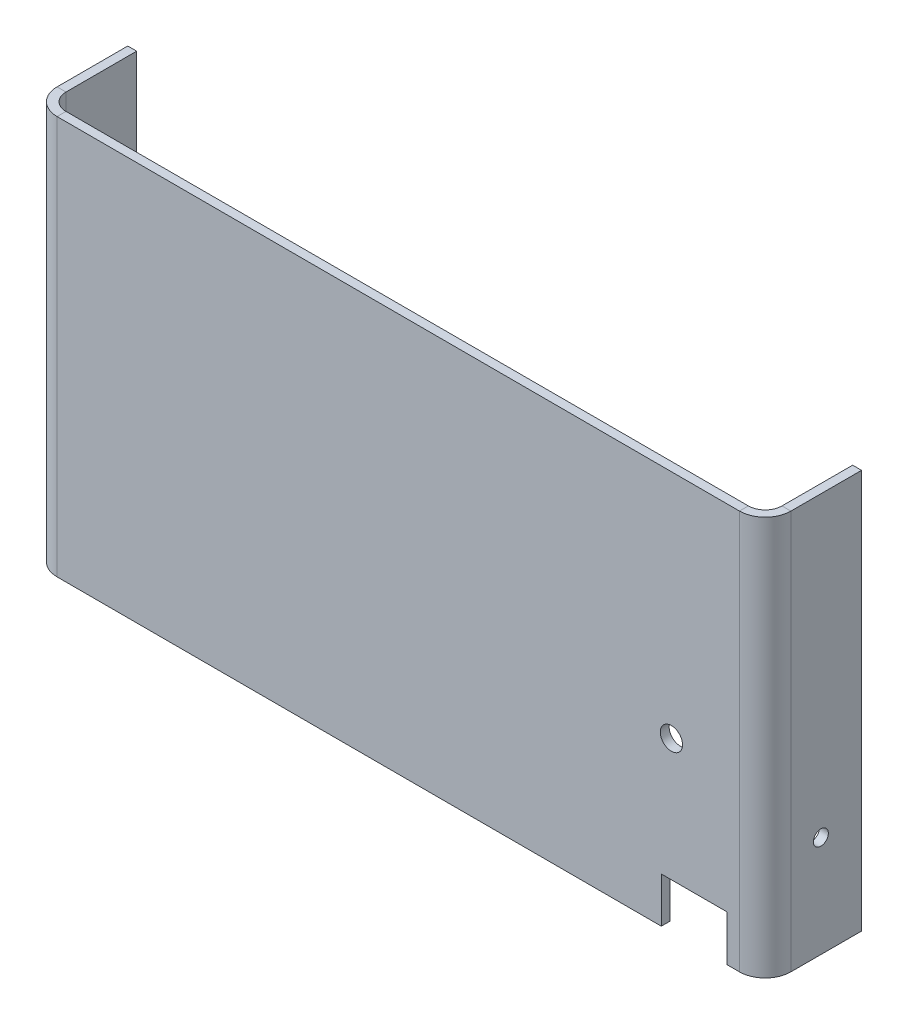
ISO-10303-21;
HEADER;
FILE_DESCRIPTION(('STEP AP214'),'2;1');
FILE_NAME('part.step','',(''),(''),'','','');
FILE_SCHEMA(('AUTOMOTIVE_DESIGN { 1 0 10303 214 1 1 1 1 }'));
ENDSEC;
DATA;
#1=APPLICATION_CONTEXT('core data for automotive mechanical design processes');
#2=APPLICATION_PROTOCOL_DEFINITION('international standard','automotive_design',2000,#1);
#3=PRODUCT_CONTEXT('',#1,'mechanical');
#4=PRODUCT('Part','Part','',(#3));
#5=PRODUCT_RELATED_PRODUCT_CATEGORY('part','',(#4));
#6=PRODUCT_DEFINITION_FORMATION('','',#4);
#7=PRODUCT_DEFINITION_CONTEXT('part definition',#1,'design');
#8=PRODUCT_DEFINITION('design','',#6,#7);
#9=PRODUCT_DEFINITION_SHAPE('','',#8);
#10=(LENGTH_UNIT() NAMED_UNIT(*) SI_UNIT(.MILLI.,.METRE.));
#11=(NAMED_UNIT(*) PLANE_ANGLE_UNIT() SI_UNIT($,.RADIAN.));
#12=(NAMED_UNIT(*) SI_UNIT($,.STERADIAN.) SOLID_ANGLE_UNIT());
#13=UNCERTAINTY_MEASURE_WITH_UNIT(LENGTH_MEASURE(1.E-05),#10,'distance_accuracy_value','');
#14=(GEOMETRIC_REPRESENTATION_CONTEXT(3) GLOBAL_UNCERTAINTY_ASSIGNED_CONTEXT((#13)) GLOBAL_UNIT_ASSIGNED_CONTEXT((#10,
#11,#12)) REPRESENTATION_CONTEXT('',''));
#15=CARTESIAN_POINT('',(0.,0.,0.));
#16=DIRECTION('',(0.,0.,1.));
#17=DIRECTION('',(1.,0.,0.));
#18=AXIS2_PLACEMENT_3D('',#15,#16,#17);
#19=CARTESIAN_POINT('',(-17.6037651662506,-31.8234781341149,2.54));
#20=DIRECTION('',(0.,-1.,0.));
#21=DIRECTION('',(1.,0.,0.));
#22=AXIS2_PLACEMENT_3D('',#19,#20,#21);
#23=PLANE('',#22);
#24=DIRECTION('',(1.,0.,0.));
#25=VECTOR('',#24,1.);
#26=CARTESIAN_POINT('',(-134.62,-31.8234781341149,1.1938));
#27=LINE('',#26,#25);
#28=CARTESIAN_POINT('',(-17.6037651662506,-31.8234781341149,1.1938));
#29=VERTEX_POINT('',#28);
#30=CARTESIAN_POINT('',(-15.7315905808416,-31.8234781341149,1.1938));
#31=VERTEX_POINT('',#30);
#32=EDGE_CURVE('E450',#29,#31,#27,.T.);
#33=ORIENTED_EDGE('',*,*,#32,.T.);
#34=DIRECTION('',(0.,0.,1.));
#35=VECTOR('',#34,1.);
#36=CARTESIAN_POINT('',(-15.7315905808416,-31.8234781341149,2.54));
#37=LINE('',#36,#35);
#38=CARTESIAN_POINT('',(-15.7315905808416,-31.8234781341149,2.54));
#39=VERTEX_POINT('',#38);
#40=EDGE_CURVE('E534',#31,#39,#37,.T.);
#41=ORIENTED_EDGE('',*,*,#40,.T.);
#42=DIRECTION('',(1.,0.,0.));
#43=VECTOR('',#42,1.);
#44=CARTESIAN_POINT('',(-17.6037651662506,-31.8234781341149,2.54));
#45=LINE('',#44,#43);
#46=CARTESIAN_POINT('',(-17.6037651662506,-31.8234781341149,2.54));
#47=VERTEX_POINT('',#46);
#48=EDGE_CURVE('E441',#47,#39,#45,.T.);
#49=ORIENTED_EDGE('',*,*,#48,.F.);
#50=DIRECTION('',(0.,0.,1.));
#51=VECTOR('',#50,1.);
#52=CARTESIAN_POINT('',(-17.6037651662506,-31.8234781341149,2.54));
#53=LINE('',#52,#51);
#54=EDGE_CURVE('E445',#29,#47,#53,.T.);
#55=ORIENTED_EDGE('',*,*,#54,.F.);
#56=EDGE_LOOP('',(#33,#41,#49,#55));
#57=FACE_BOUND('',#56,.T.);
#58=ADVANCED_FACE('F63',(#57),#23,.T.);
#59=CARTESIAN_POINT('',(-2.77420292184407E-05,28.5015218658787,2.54));
#60=DIRECTION('',(0.000641991522611136,0.999999793923421,0.));
#61=DIRECTION('',(-0.999999793923421,0.000641991522611136,0.));
#62=AXIS2_PLACEMENT_3D('',#59,#60,#61);
#63=PLANE('',#62);
#64=DIRECTION('',(-0.999999793923421,0.000641991522611136,0.));
#65=VECTOR('',#64,1.);
#66=CARTESIAN_POINT('',(-2.77420292184407E-05,28.5015218658787,2.54));
#67=LINE('',#66,#65);
#68=CARTESIAN_POINT('',(-15.7315905808416,28.5116213979399,2.54));
#69=VERTEX_POINT('',#68);
#70=CARTESIAN_POINT('',(-118.888437161188,28.5778472325914,2.54));
#71=VERTEX_POINT('',#70);
#72=EDGE_CURVE('E446',#69,#71,#67,.T.);
#73=ORIENTED_EDGE('',*,*,#72,.F.);
#74=CARTESIAN_POINT('',(-15.7315905808416,28.5116213979399,1.1938));
#75=CARTESIAN_POINT('',(-15.7315905808416,28.5116213979399,2.54));
#76=B_SPLINE_CURVE_WITH_KNOTS('',1,(#74,#75),.UNSPECIFIED.,.F.,.F.,(2,2),(0.,1.),.UNSPECIFIED.);
#77=CARTESIAN_POINT('',(-15.7315905808416,28.5116213979399,1.1938));
#78=VERTEX_POINT('',#77);
#79=EDGE_CURVE('E12',#69,#78,#76,.F.);
#80=ORIENTED_EDGE('',*,*,#79,.T.);
#81=DIRECTION('',(-0.999999793923421,0.000641991522611136,0.));
#82=VECTOR('',#81,1.);
#83=CARTESIAN_POINT('',(-2.77420292184407E-05,28.5015218658787,1.1938));
#84=LINE('',#83,#82);
#85=CARTESIAN_POINT('',(-118.888437161188,28.5778472325914,1.1938));
#86=VERTEX_POINT('',#85);
#87=EDGE_CURVE('E460',#78,#86,#84,.T.);
#88=ORIENTED_EDGE('',*,*,#87,.T.);
#89=CARTESIAN_POINT('',(-118.888437161188,28.5778472325914,2.54));
#90=CARTESIAN_POINT('',(-118.888437161188,28.5778472325914,1.1938));
#91=B_SPLINE_CURVE_WITH_KNOTS('',1,(#89,#90),.UNSPECIFIED.,.F.,.F.,(2,2),(0.,1.),.UNSPECIFIED.);
#92=EDGE_CURVE('E422',#71,#86,#91,.T.);
#93=ORIENTED_EDGE('',*,*,#92,.F.);
#94=EDGE_LOOP('',(#73,#80,#88,#93));
#95=FACE_BOUND('',#94,.T.);
#96=ADVANCED_FACE('F65',(#95),#63,.T.);
#97=CARTESIAN_POINT('',(-134.62,-24.9109239929339,2.54));
#98=DIRECTION('',(0.,0.,1.));
#99=DIRECTION('',(1.,0.,0.));
#100=AXIS2_PLACEMENT_3D('',#97,#98,#99);
#101=PLANE('',#100);
#102=CARTESIAN_POINT('',(-26.0210000000003,-6.40070001477098,2.54));
#103=DIRECTION('',(0.,0.,1.));
#104=DIRECTION('',(1.,0.,0.));
#105=AXIS2_PLACEMENT_3D('',#102,#103,#104);
#106=CIRCLE('',#105,1.68394793953573);
#107=CARTESIAN_POINT('',(-24.3370520604646,-6.40070001477098,2.54));
#108=VERTEX_POINT('',#107);
#109=EDGE_CURVE('E442',#108,#108,#106,.T.);
#110=ORIENTED_EDGE('',*,*,#109,.F.);
#111=EDGE_LOOP('',(#110));
#112=FACE_BOUND('',#111,.T.);
#113=ORIENTED_EDGE('',*,*,#48,.T.);
#114=DIRECTION('',(0.,1.,0.));
#115=VECTOR('',#114,1.);
#116=CARTESIAN_POINT('',(-15.7315905808416,-24.9109239929339,2.54));
#117=LINE('',#116,#115);
#118=EDGE_CURVE('E529',#39,#69,#117,.T.);
#119=ORIENTED_EDGE('',*,*,#118,.T.);
#120=ORIENTED_EDGE('',*,*,#72,.T.);
#121=DIRECTION('',(0.,1.,0.));
#122=VECTOR('',#121,1.);
#123=CARTESIAN_POINT('',(-118.888437161188,-24.9109239929339,2.54));
#124=LINE('',#123,#122);
#125=CARTESIAN_POINT('',(-118.888437161188,-31.6913606575086,2.54));
#126=VERTEX_POINT('',#125);
#127=EDGE_CURVE('E469',#126,#71,#124,.T.);
#128=ORIENTED_EDGE('',*,*,#127,.F.);
#129=DIRECTION('',(0.999999793923421,-0.000641991522610961,0.));
#130=VECTOR('',#129,1.);
#131=CARTESIAN_POINT('',(-134.62,-31.6812611254473,2.54));
#132=LINE('',#131,#130);
#133=CARTESIAN_POINT('',(-27.5487101679567,-31.75,2.54));
#134=VERTEX_POINT('',#133);
#135=EDGE_CURVE('E435',#126,#134,#132,.T.);
#136=ORIENTED_EDGE('',*,*,#135,.T.);
#137=DIRECTION('',(0.,1.,0.));
#138=VECTOR('',#137,1.);
#139=CARTESIAN_POINT('',(-27.5487101679567,-31.75,2.54));
#140=LINE('',#139,#138);
#141=CARTESIAN_POINT('',(-27.5487101679567,-24.9109239929339,2.54));
#142=VERTEX_POINT('',#141);
#143=EDGE_CURVE('E426',#134,#142,#140,.T.);
#144=ORIENTED_EDGE('',*,*,#143,.T.);
#145=DIRECTION('',(1.,0.,0.));
#146=VECTOR('',#145,1.);
#147=CARTESIAN_POINT('',(-27.5487101679567,-24.9109239929339,2.54));
#148=LINE('',#147,#146);
#149=CARTESIAN_POINT('',(-17.6037651662506,-24.9109239929339,2.54));
#150=VERTEX_POINT('',#149);
#151=EDGE_CURVE('E434',#142,#150,#148,.T.);
#152=ORIENTED_EDGE('',*,*,#151,.T.);
#153=DIRECTION('',(0.,-1.,0.));
#154=VECTOR('',#153,1.);
#155=CARTESIAN_POINT('',(-17.6037651662506,-24.9109239929339,2.54));
#156=LINE('',#155,#154);
#157=EDGE_CURVE('E438',#150,#47,#156,.T.);
#158=ORIENTED_EDGE('',*,*,#157,.T.);
#159=EDGE_LOOP('',(#113,#119,#120,#128,#136,#144,#152,#158));
#160=FACE_BOUND('',#159,.T.);
#161=ADVANCED_FACE('F498',(#112,#160),#101,.T.);
#162=CARTESIAN_POINT('',(-134.62,-24.9109239929339,1.1938));
#163=DIRECTION('',(0.,0.,1.));
#164=DIRECTION('',(1.,0.,0.));
#165=AXIS2_PLACEMENT_3D('',#162,#163,#164);
#166=PLANE('',#165);
#167=DIRECTION('',(0.,1.,0.));
#168=VECTOR('',#167,1.);
#169=CARTESIAN_POINT('',(-15.7315905808416,-24.9109239929339,1.1938));
#170=LINE('',#169,#168);
#171=EDGE_CURVE('E75',#31,#78,#170,.T.);
#172=ORIENTED_EDGE('',*,*,#171,.F.);
#173=ORIENTED_EDGE('',*,*,#32,.F.);
#174=DIRECTION('',(0.,1.,0.));
#175=VECTOR('',#174,1.);
#176=CARTESIAN_POINT('',(-17.6037651662506,-24.9109239929339,1.1938));
#177=LINE('',#176,#175);
#178=CARTESIAN_POINT('',(-17.6037651662506,-24.9109239929339,1.1938));
#179=VERTEX_POINT('',#178);
#180=EDGE_CURVE('E447',#179,#29,#177,.F.);
#181=ORIENTED_EDGE('',*,*,#180,.F.);
#182=DIRECTION('',(1.,0.,0.));
#183=VECTOR('',#182,1.);
#184=CARTESIAN_POINT('',(-134.62,-24.9109239929339,1.1938));
#185=LINE('',#184,#183);
#186=CARTESIAN_POINT('',(-27.5487101679567,-24.9109239929339,1.1938));
#187=VERTEX_POINT('',#186);
#188=EDGE_CURVE('E451',#187,#179,#185,.T.);
#189=ORIENTED_EDGE('',*,*,#188,.F.);
#190=DIRECTION('',(0.,1.,0.));
#191=VECTOR('',#190,1.);
#192=CARTESIAN_POINT('',(-27.5487101679567,-24.9109239929339,1.1938));
#193=LINE('',#192,#191);
#194=CARTESIAN_POINT('',(-27.5487101679567,-31.75,1.1938));
#195=VERTEX_POINT('',#194);
#196=EDGE_CURVE('E454',#195,#187,#193,.T.);
#197=ORIENTED_EDGE('',*,*,#196,.F.);
#198=DIRECTION('',(0.999999793923421,-0.000641991522610961,0.));
#199=VECTOR('',#198,1.);
#200=CARTESIAN_POINT('',(-134.62,-31.6812611254473,1.1938));
#201=LINE('',#200,#199);
#202=CARTESIAN_POINT('',(-118.888437161188,-31.6913606575086,1.1938));
#203=VERTEX_POINT('',#202);
#204=EDGE_CURVE('E91',#203,#195,#201,.T.);
#205=ORIENTED_EDGE('',*,*,#204,.F.);
#206=DIRECTION('',(0.,1.,0.));
#207=VECTOR('',#206,1.);
#208=CARTESIAN_POINT('',(-118.888437161188,-24.9109239929339,1.1938));
#209=LINE('',#208,#207);
#210=EDGE_CURVE('E484',#203,#86,#209,.T.);
#211=ORIENTED_EDGE('',*,*,#210,.T.);
#212=ORIENTED_EDGE('',*,*,#87,.F.);
#213=EDGE_LOOP('',(#172,#173,#181,#189,#197,#205,#211,#212));
#214=FACE_BOUND('',#213,.T.);
#215=CARTESIAN_POINT('',(-26.0210000000003,-6.40070001477098,1.1938));
#216=DIRECTION('',(0.,0.,1.));
#217=DIRECTION('',(1.,0.,0.));
#218=AXIS2_PLACEMENT_3D('',#215,#216,#217);
#219=CIRCLE('',#218,1.68394793953573);
#220=CARTESIAN_POINT('',(-24.3370520604646,-6.40070001477098,1.1938));
#221=VERTEX_POINT('',#220);
#222=EDGE_CURVE('E457',#221,#221,#219,.T.);
#223=ORIENTED_EDGE('',*,*,#222,.T.);
#224=EDGE_LOOP('',(#223));
#225=FACE_BOUND('',#224,.T.);
#226=ADVANCED_FACE('F501',(#214,#225),#166,.F.);
#227=CARTESIAN_POINT('',(-27.5487101679567,-31.75,2.54));
#228=DIRECTION('',(1.,0.,0.));
#229=DIRECTION('',(0.,1.,0.));
#230=AXIS2_PLACEMENT_3D('',#227,#228,#229);
#231=PLANE('',#230);
#232=DIRECTION('',(0.,0.,1.));
#233=VECTOR('',#232,1.);
#234=CARTESIAN_POINT('',(-27.5487101679567,-31.75,2.54));
#235=LINE('',#234,#233);
#236=EDGE_CURVE('E466',#195,#134,#235,.T.);
#237=ORIENTED_EDGE('',*,*,#236,.F.);
#238=ORIENTED_EDGE('',*,*,#196,.T.);
#239=DIRECTION('',(0.,0.,1.));
#240=VECTOR('',#239,1.);
#241=CARTESIAN_POINT('',(-27.5487101679567,-24.9109239929339,2.54));
#242=LINE('',#241,#240);
#243=EDGE_CURVE('E464',#187,#142,#242,.T.);
#244=ORIENTED_EDGE('',*,*,#243,.T.);
#245=ORIENTED_EDGE('',*,*,#143,.F.);
#246=EDGE_LOOP('',(#237,#238,#244,#245));
#247=FACE_BOUND('',#246,.T.);
#248=ADVANCED_FACE('F506',(#247),#231,.T.);
#249=CARTESIAN_POINT('',(-27.5487101679567,-24.9109239929339,2.54));
#250=DIRECTION('',(0.,-1.,0.));
#251=DIRECTION('',(1.,0.,0.));
#252=AXIS2_PLACEMENT_3D('',#249,#250,#251);
#253=PLANE('',#252);
#254=ORIENTED_EDGE('',*,*,#243,.F.);
#255=ORIENTED_EDGE('',*,*,#188,.T.);
#256=DIRECTION('',(0.,0.,1.));
#257=VECTOR('',#256,1.);
#258=CARTESIAN_POINT('',(-17.6037651662506,-24.9109239929339,2.54));
#259=LINE('',#258,#257);
#260=EDGE_CURVE('E462',#179,#150,#259,.T.);
#261=ORIENTED_EDGE('',*,*,#260,.T.);
#262=ORIENTED_EDGE('',*,*,#151,.F.);
#263=EDGE_LOOP('',(#254,#255,#261,#262));
#264=FACE_BOUND('',#263,.T.);
#265=ADVANCED_FACE('F510',(#264),#253,.T.);
#266=CARTESIAN_POINT('',(-17.6037651662506,-24.9109239929339,2.54));
#267=DIRECTION('',(-1.,0.,0.));
#268=DIRECTION('',(0.,-1.,0.));
#269=AXIS2_PLACEMENT_3D('',#266,#267,#268);
#270=PLANE('',#269);
#271=ORIENTED_EDGE('',*,*,#260,.F.);
#272=ORIENTED_EDGE('',*,*,#180,.T.);
#273=ORIENTED_EDGE('',*,*,#54,.T.);
#274=ORIENTED_EDGE('',*,*,#157,.F.);
#275=EDGE_LOOP('',(#271,#272,#273,#274));
#276=FACE_BOUND('',#275,.T.);
#277=ADVANCED_FACE('F396',(#276),#270,.T.);
#278=CARTESIAN_POINT('',(-134.62,-31.6812611254473,2.54));
#279=DIRECTION('',(-0.000641991522610961,-0.999999793923421,0.));
#280=DIRECTION('',(0.999999793923421,-0.000641991522610961,0.));
#281=AXIS2_PLACEMENT_3D('',#278,#279,#280);
#282=PLANE('',#281);
#283=CARTESIAN_POINT('',(-118.888437161188,-31.6913606575086,1.1938));
#284=CARTESIAN_POINT('',(-118.888437161188,-31.6913606575086,2.54));
#285=B_SPLINE_CURVE_WITH_KNOTS('',1,(#283,#284),.UNSPECIFIED.,.F.,.F.,(2,2),(0.,1.),.UNSPECIFIED.);
#286=EDGE_CURVE('E479',#203,#126,#285,.T.);
#287=ORIENTED_EDGE('',*,*,#286,.F.);
#288=ORIENTED_EDGE('',*,*,#204,.T.);
#289=ORIENTED_EDGE('',*,*,#236,.T.);
#290=ORIENTED_EDGE('',*,*,#135,.F.);
#291=EDGE_LOOP('',(#287,#288,#289,#290));
#292=FACE_BOUND('',#291,.T.);
#293=ADVANCED_FACE('F486',(#292),#282,.T.);
#294=CARTESIAN_POINT('',(-26.0210000000003,-6.40070001477098,2.54));
#295=DIRECTION('',(0.,0.,1.));
#296=DIRECTION('',(1.,0.,0.));
#297=AXIS2_PLACEMENT_3D('',#294,#295,#296);
#298=CYLINDRICAL_SURFACE('',#297,1.68394793953573);
#299=ORIENTED_EDGE('',*,*,#109,.T.);
#300=EDGE_LOOP('',(#299));
#301=FACE_BOUND('',#300,.T.);
#302=ORIENTED_EDGE('',*,*,#222,.F.);
#303=EDGE_LOOP('',(#302));
#304=FACE_BOUND('',#303,.T.);
#305=ADVANCED_FACE('F496',(#301,#304),#298,.F.);
#306=CARTESIAN_POINT('',(-122.774637161188,-31.6881204449422,-1.34620000000001));
#307=CARTESIAN_POINT('',(-122.774637161188,-31.6883905113395,-0.837405891937508));
#308=CARTESIAN_POINT('',(-122.673489777256,-31.68866048037,-0.328995371802974));
#309=CARTESIAN_POINT('',(-122.28414582361,-31.6892005157977,0.610964081517382));
#310=CARTESIAN_POINT('',(-121.996102444116,-31.6894705335115,1.04205146316651));
#311=CARTESIAN_POINT('',(-121.276688624354,-31.6900105689393,1.7614652829278));
#312=CARTESIAN_POINT('',(-120.845601242705,-31.6902805866531,2.04950866242231));
#313=CARTESIAN_POINT('',(-119.905641789385,-31.6908206220808,2.43885261606841));
#314=CARTESIAN_POINT('',(-119.39723126925,-31.6910905911112,2.54));
#315=CARTESIAN_POINT('',(-118.888437161188,-31.6913606575086,2.54));
#316=CARTESIAN_POINT('',(-121.428437161188,-31.6881204449422,-1.34620000000001));
#317=CARTESIAN_POINT('',(-121.428437161188,-31.6883905113395,-1.01365483135435));
#318=CARTESIAN_POINT('',(-121.362327759925,-31.68866048037,-0.681360373727434));
#319=CARTESIAN_POINT('',(-121.107854587608,-31.6892005157977,-0.0670077898579207));
#320=CARTESIAN_POINT('',(-120.919590940879,-31.6894705335115,0.214748668736279));
#321=CARTESIAN_POINT('',(-120.449385829924,-31.6900105689393,0.684953779691374));
#322=CARTESIAN_POINT('',(-120.16762937133,-31.6902805866531,0.873217426419811));
#323=CARTESIAN_POINT('',(-119.55327678746,-31.6908206220808,1.12769059873752));
#324=CARTESIAN_POINT('',(-119.220982329833,-31.6910905911113,1.1938));
#325=CARTESIAN_POINT('',(-118.888437161188,-31.6913606575086,1.1938));
#326=B_SPLINE_SURFACE_WITH_KNOTS('',1,3,((#306,#307,#308,#309,#310,#311,#312,#313,#314,#315),
(#316,#317,#318,#319,#320,#321,#322,#323,#324,#325)),.UNSPECIFIED.,.F.,.F.,.F.,(2,2),(4,2,2,2,
4),(0.,1.),(0.,0.25,0.5,0.75,1.),.UNSPECIFIED.);
#327=CARTESIAN_POINT('',(-122.774637161188,-31.6881204449422,-1.34620000000001));
#328=CARTESIAN_POINT('',(-121.428437161188,-31.6881204449422,-1.34620000000001));
#329=B_SPLINE_CURVE_WITH_KNOTS('',1,(#327,#328),.UNSPECIFIED.,.F.,.F.,(2,2),(0.,1.),.UNSPECIFIED.);
#330=CARTESIAN_POINT('',(-121.428437161188,-31.6881204449422,-1.34620000000001));
#331=VERTEX_POINT('',#330);
#332=CARTESIAN_POINT('',(-122.774637161188,-31.6881204449422,-1.34620000000001));
#333=VERTEX_POINT('',#332);
#334=EDGE_CURVE('E608',#331,#333,#329,.F.);
#335=CARTESIAN_POINT('',(-121.428437161188,-31.6881204449422,-1.34620000000001));
#336=CARTESIAN_POINT('',(-121.428437161188,-31.6883905113395,-1.01365483135435));
#337=CARTESIAN_POINT('',(-121.362327759925,-31.68866048037,-0.681360373727434));
#338=CARTESIAN_POINT('',(-121.107854587608,-31.6892005157977,-0.0670077898579207));
#339=CARTESIAN_POINT('',(-120.919590940879,-31.6894705335115,0.214748668736279));
#340=CARTESIAN_POINT('',(-120.449385829924,-31.6900105689393,0.684953779691374));
#341=CARTESIAN_POINT('',(-120.16762937133,-31.6902805866531,0.873217426419811));
#342=CARTESIAN_POINT('',(-119.55327678746,-31.6908206220808,1.12769059873752));
#343=CARTESIAN_POINT('',(-119.220982329833,-31.6910905911113,1.1938));
#344=CARTESIAN_POINT('',(-118.888437161188,-31.6913606575086,1.1938));
#345=B_SPLINE_CURVE_WITH_KNOTS('',3,(#335,#336,#337,#338,#339,#340,#341,#342,#343,#344),
.UNSPECIFIED.,.F.,.F.,(4,2,2,2,4),(0.,0.25,0.5,0.75,1.),.UNSPECIFIED.);
#346=EDGE_CURVE('E610',#331,#203,#345,.T.);
#347=CARTESIAN_POINT('',(-118.888437161188,-31.6913606575086,2.54));
#348=CARTESIAN_POINT('',(-119.39723126925,-31.6910905911112,2.54));
#349=CARTESIAN_POINT('',(-119.905641789385,-31.6908206220808,2.43885261606841));
#350=CARTESIAN_POINT('',(-120.845601242705,-31.6902805866531,2.04950866242231));
#351=CARTESIAN_POINT('',(-121.276688624354,-31.6900105689393,1.7614652829278));
#352=CARTESIAN_POINT('',(-121.996102444116,-31.6894705335115,1.04205146316651));
#353=CARTESIAN_POINT('',(-122.28414582361,-31.6892005157977,0.610964081517382));
#354=CARTESIAN_POINT('',(-122.673489777256,-31.68866048037,-0.328995371802974));
#355=CARTESIAN_POINT('',(-122.774637161188,-31.6883905113395,-0.837405891937508));
#356=CARTESIAN_POINT('',(-122.774637161188,-31.6881204449422,-1.34620000000001));
#357=B_SPLINE_CURVE_WITH_KNOTS('',3,(#347,#348,#349,#350,#351,#352,#353,#354,#355,#356),
.UNSPECIFIED.,.F.,.F.,(4,2,2,2,4),(0.,0.25,0.5,0.75,1.),.UNSPECIFIED.);
#358=EDGE_CURVE('E611',#333,#126,#357,.F.);
#359=ORIENTED_EDGE('',*,*,#334,.F.);
#360=ORIENTED_EDGE('',*,*,#346,.T.);
#361=ORIENTED_EDGE('',*,*,#286,.T.);
#362=ORIENTED_EDGE('',*,*,#358,.F.);
#363=EDGE_LOOP('',(#359,#360,#361,#362));
#364=FACE_BOUND('',#363,.T.);
#365=ADVANCED_FACE('F392',(#364),#326,.T.);
#366=CARTESIAN_POINT('',(-118.888437161188,28.5778472325914,2.54));
#367=CARTESIAN_POINT('',(-119.39723126925,28.5781172989887,2.54));
#368=CARTESIAN_POINT('',(-119.905641789385,28.5783872680191,2.43885261606841));
#369=CARTESIAN_POINT('',(-120.845601242705,28.5789273034468,2.04950866242231));
#370=CARTESIAN_POINT('',(-121.276688624354,28.5791973211607,1.7614652829278));
#371=CARTESIAN_POINT('',(-121.996102444116,28.5797373565884,1.0420514631665));
#372=CARTESIAN_POINT('',(-122.28414582361,28.5800073743023,0.610964081517371));
#373=CARTESIAN_POINT('',(-122.673489777256,28.58054740973,-0.328995371802989));
#374=CARTESIAN_POINT('',(-122.774637161188,28.5808173787604,-0.837405891937525));
#375=CARTESIAN_POINT('',(-122.774637161188,28.5810874451577,-1.34620000000003));
#376=CARTESIAN_POINT('',(-118.888437161188,28.5778472325914,1.1938));
#377=CARTESIAN_POINT('',(-119.220982329833,28.5781172989887,1.1938));
#378=CARTESIAN_POINT('',(-119.55327678746,28.5783872680191,1.12769059873752));
#379=CARTESIAN_POINT('',(-120.16762937133,28.5789273034468,0.873217426419811));
#380=CARTESIAN_POINT('',(-120.449385829924,28.5791973211607,0.68495377969137));
#381=CARTESIAN_POINT('',(-120.919590940879,28.5797373565884,0.214748668736273));
#382=CARTESIAN_POINT('',(-121.107854587608,28.5800073743023,-0.0670077898579286));
#383=CARTESIAN_POINT('',(-121.362327759925,28.58054740973,-0.681360373727444));
#384=CARTESIAN_POINT('',(-121.428437161188,28.5808173787604,-1.01365483135436));
#385=CARTESIAN_POINT('',(-121.428437161188,28.5810874451577,-1.34620000000002));
#386=B_SPLINE_SURFACE_WITH_KNOTS('',1,3,((#366,#367,#368,#369,#370,#371,#372,#373,#374,#375),
(#376,#377,#378,#379,#380,#381,#382,#383,#384,#385)),.UNSPECIFIED.,.F.,.F.,.F.,(2,2),(4,2,2,2,
4),(0.,1.),(0.,0.25,0.5,0.75,1.),.UNSPECIFIED.);
#387=CARTESIAN_POINT('',(-118.888437161188,28.5778472325914,1.1938));
#388=CARTESIAN_POINT('',(-119.220982329833,28.5781172989887,1.1938));
#389=CARTESIAN_POINT('',(-119.55327678746,28.5783872680191,1.12769059873752));
#390=CARTESIAN_POINT('',(-120.16762937133,28.5789273034468,0.873217426419811));
#391=CARTESIAN_POINT('',(-120.449385829924,28.5791973211607,0.68495377969137));
#392=CARTESIAN_POINT('',(-120.919590940879,28.5797373565884,0.214748668736273));
#393=CARTESIAN_POINT('',(-121.107854587608,28.5800073743023,-0.0670077898579286));
#394=CARTESIAN_POINT('',(-121.362327759925,28.58054740973,-0.681360373727444));
#395=CARTESIAN_POINT('',(-121.428437161188,28.5808173787604,-1.01365483135436));
#396=CARTESIAN_POINT('',(-121.428437161188,28.5810874451577,-1.34620000000002));
#397=B_SPLINE_CURVE_WITH_KNOTS('',3,(#387,#388,#389,#390,#391,#392,#393,#394,#395,#396),
.UNSPECIFIED.,.F.,.F.,(4,2,2,2,4),(0.,0.25,0.5,0.75,1.),.UNSPECIFIED.);
#398=CARTESIAN_POINT('',(-121.428437161188,28.5810874451577,-1.34620000000001));
#399=VERTEX_POINT('',#398);
#400=EDGE_CURVE('E364',#86,#399,#397,.T.);
#401=CARTESIAN_POINT('',(-121.428437161188,28.5810874451577,-1.34620000000002));
#402=CARTESIAN_POINT('',(-122.774637161188,28.5810874451577,-1.34620000000003));
#403=B_SPLINE_CURVE_WITH_KNOTS('',1,(#401,#402),.UNSPECIFIED.,.F.,.F.,(2,2),(0.,1.),.UNSPECIFIED.);
#404=CARTESIAN_POINT('',(-122.774637161188,28.5810874451577,-1.34620000000003));
#405=VERTEX_POINT('',#404);
#406=EDGE_CURVE('E306',#405,#399,#403,.F.);
#407=CARTESIAN_POINT('',(-122.774637161188,28.5810874451577,-1.34620000000003));
#408=CARTESIAN_POINT('',(-122.774637161188,28.5808173787604,-0.837405891937525));
#409=CARTESIAN_POINT('',(-122.673489777256,28.58054740973,-0.328995371802989));
#410=CARTESIAN_POINT('',(-122.28414582361,28.5800073743023,0.610964081517371));
#411=CARTESIAN_POINT('',(-121.996102444116,28.5797373565884,1.0420514631665));
#412=CARTESIAN_POINT('',(-121.276688624354,28.5791973211607,1.7614652829278));
#413=CARTESIAN_POINT('',(-120.845601242705,28.5789273034468,2.04950866242231));
#414=CARTESIAN_POINT('',(-119.905641789385,28.5783872680191,2.43885261606841));
#415=CARTESIAN_POINT('',(-119.39723126925,28.5781172989887,2.54));
#416=CARTESIAN_POINT('',(-118.888437161188,28.5778472325914,2.54));
#417=B_SPLINE_CURVE_WITH_KNOTS('',3,(#407,#408,#409,#410,#411,#412,#413,#414,#415,#416),
.UNSPECIFIED.,.F.,.F.,(4,2,2,2,4),(0.,0.25,0.5,0.75,1.),.UNSPECIFIED.);
#418=EDGE_CURVE('E357',#71,#405,#417,.F.);
#419=ORIENTED_EDGE('',*,*,#400,.T.);
#420=ORIENTED_EDGE('',*,*,#406,.F.);
#421=ORIENTED_EDGE('',*,*,#418,.F.);
#422=ORIENTED_EDGE('',*,*,#92,.T.);
#423=EDGE_LOOP('',(#419,#420,#421,#422));
#424=FACE_BOUND('',#423,.T.);
#425=ADVANCED_FACE('F331',(#424),#386,.T.);
#426=CARTESIAN_POINT('',(-118.888437161188,58.9416212189731,-1.3462));
#427=DIRECTION('',(0.,-1.,0.));
#428=DIRECTION('',(1.,0.,0.));
#429=AXIS2_PLACEMENT_3D('',#426,#427,#428);
#430=CYLINDRICAL_SURFACE('',#429,3.8862);
#431=ORIENTED_EDGE('',*,*,#127,.T.);
#432=ORIENTED_EDGE('',*,*,#418,.T.);
#433=DIRECTION('',(0.,1.,0.));
#434=VECTOR('',#433,1.);
#435=CARTESIAN_POINT('',(-122.774637161188,-24.9109239929339,-1.34620000000001));
#436=LINE('',#435,#434);
#437=EDGE_CURVE('E567',#333,#405,#436,.T.);
#438=ORIENTED_EDGE('',*,*,#437,.F.);
#439=ORIENTED_EDGE('',*,*,#358,.T.);
#440=EDGE_LOOP('',(#431,#432,#438,#439));
#441=FACE_BOUND('',#440,.T.);
#442=ADVANCED_FACE('F320',(#441),#430,.T.);
#443=CARTESIAN_POINT('',(-118.888437161188,58.9416212189731,-1.3462));
#444=DIRECTION('',(0.,-1.,0.));
#445=DIRECTION('',(1.,0.,0.));
#446=AXIS2_PLACEMENT_3D('',#443,#444,#445);
#447=CYLINDRICAL_SURFACE('',#446,2.54);
#448=ORIENTED_EDGE('',*,*,#210,.F.);
#449=ORIENTED_EDGE('',*,*,#346,.F.);
#450=DIRECTION('',(0.,1.,0.));
#451=VECTOR('',#450,1.);
#452=CARTESIAN_POINT('',(-121.428437161188,-24.9109239929339,-1.34619999999999));
#453=LINE('',#452,#451);
#454=EDGE_CURVE('E246',#331,#399,#453,.T.);
#455=ORIENTED_EDGE('',*,*,#454,.T.);
#456=ORIENTED_EDGE('',*,*,#400,.F.);
#457=EDGE_LOOP('',(#448,#449,#455,#456));
#458=FACE_BOUND('',#457,.T.);
#459=ADVANCED_FACE('F330',(#458),#447,.F.);
#460=CARTESIAN_POINT('',(-122.774637161188,28.5879467646526,-12.0306371611876));
#461=DIRECTION('',(0.,0.,-1.));
#462=DIRECTION('',(0.,-1.,0.));
#463=AXIS2_PLACEMENT_3D('',#460,#461,#462);
#464=PLANE('',#463);
#465=DIRECTION('',(-1.,0.,0.));
#466=VECTOR('',#465,1.);
#467=CARTESIAN_POINT('',(-122.774637161188,28.5879467646526,-12.0306371611876));
#468=LINE('',#467,#466);
#469=CARTESIAN_POINT('',(-121.428437161188,28.5879467646526,-12.0306371611876));
#470=VERTEX_POINT('',#469);
#471=CARTESIAN_POINT('',(-122.774637161188,28.5879467646526,-12.0306371611876));
#472=VERTEX_POINT('',#471);
#473=EDGE_CURVE('E293',#470,#472,#468,.T.);
#474=ORIENTED_EDGE('',*,*,#473,.F.);
#475=DIRECTION('',(0.,1.,0.));
#476=VECTOR('',#475,1.);
#477=CARTESIAN_POINT('',(-121.428437161188,-24.9109239929339,-12.0306371611876));
#478=LINE('',#477,#476);
#479=CARTESIAN_POINT('',(-121.428437161188,-31.6812611254473,-12.0306371611877));
#480=VERTEX_POINT('',#479);
#481=EDGE_CURVE('E311',#470,#480,#478,.F.);
#482=ORIENTED_EDGE('',*,*,#481,.T.);
#483=DIRECTION('',(-1.,0.,0.));
#484=VECTOR('',#483,1.);
#485=CARTESIAN_POINT('',(-122.774637161188,-31.6812611254473,-12.0306371611877));
#486=LINE('',#485,#484);
#487=CARTESIAN_POINT('',(-122.774637161188,-31.6812611254473,-12.0306371611877));
#488=VERTEX_POINT('',#487);
#489=EDGE_CURVE('E308',#480,#488,#486,.T.);
#490=ORIENTED_EDGE('',*,*,#489,.T.);
#491=DIRECTION('',(0.,-1.,0.));
#492=VECTOR('',#491,1.);
#493=CARTESIAN_POINT('',(-122.774637161188,28.5879467646526,-12.0306371611876));
#494=LINE('',#493,#492);
#495=EDGE_CURVE('E303',#472,#488,#494,.T.);
#496=ORIENTED_EDGE('',*,*,#495,.F.);
#497=EDGE_LOOP('',(#474,#482,#490,#496));
#498=FACE_BOUND('',#497,.T.);
#499=ADVANCED_FACE('F269',(#498),#464,.T.);
#500=CARTESIAN_POINT('',(-122.774637161188,-24.9109239929339,-12.0306371611877));
#501=DIRECTION('',(-1.,0.,0.));
#502=DIRECTION('',(0.,0.,1.));
#503=AXIS2_PLACEMENT_3D('',#500,#501,#502);
#504=PLANE('',#503);
#505=DIRECTION('',(0.,-0.000641991522611191,0.999999793923421));
#506=VECTOR('',#505,1.);
#507=CARTESIAN_POINT('',(-122.774637161188,-31.6812611254473,-12.0306371611877));
#508=LINE('',#507,#506);
#509=EDGE_CURVE('E310',#488,#333,#508,.T.);
#510=ORIENTED_EDGE('',*,*,#509,.T.);
#511=ORIENTED_EDGE('',*,*,#437,.T.);
#512=DIRECTION('',(0.,0.000641991522611366,-0.999999793923421));
#513=VECTOR('',#512,1.);
#514=CARTESIAN_POINT('',(-122.774637161188,28.5015218658787,122.589335096783));
#515=LINE('',#514,#513);
#516=EDGE_CURVE('E307',#405,#472,#515,.T.);
#517=ORIENTED_EDGE('',*,*,#516,.T.);
#518=ORIENTED_EDGE('',*,*,#495,.T.);
#519=EDGE_LOOP('',(#510,#511,#517,#518));
#520=FACE_BOUND('',#519,.T.);
#521=ADVANCED_FACE('F594',(#520),#504,.T.);
#522=CARTESIAN_POINT('',(-122.774637161188,28.5015218658787,122.589335096783));
#523=DIRECTION('',(0.,0.999999793923421,0.000641991522611366));
#524=DIRECTION('',(0.,0.000641991522611366,-0.999999793923421));
#525=AXIS2_PLACEMENT_3D('',#522,#523,#524);
#526=PLANE('',#525);
#527=ORIENTED_EDGE('',*,*,#516,.F.);
#528=ORIENTED_EDGE('',*,*,#406,.T.);
#529=DIRECTION('',(0.,0.000641991522611366,-0.999999793923421));
#530=VECTOR('',#529,1.);
#531=CARTESIAN_POINT('',(-121.428437161188,28.5015218658787,122.589335096783));
#532=LINE('',#531,#530);
#533=EDGE_CURVE('E302',#399,#470,#532,.T.);
#534=ORIENTED_EDGE('',*,*,#533,.T.);
#535=ORIENTED_EDGE('',*,*,#473,.T.);
#536=EDGE_LOOP('',(#527,#528,#534,#535));
#537=FACE_BOUND('',#536,.T.);
#538=ADVANCED_FACE('F585',(#537),#526,.T.);
#539=CARTESIAN_POINT('',(-121.428437161188,-24.9109239929339,-12.0306371611877));
#540=DIRECTION('',(-1.,0.,0.));
#541=DIRECTION('',(0.,0.,1.));
#542=AXIS2_PLACEMENT_3D('',#539,#540,#541);
#543=PLANE('',#542);
#544=ORIENTED_EDGE('',*,*,#454,.F.);
#545=DIRECTION('',(0.,-0.000641991522611191,0.999999793923421));
#546=VECTOR('',#545,1.);
#547=CARTESIAN_POINT('',(-121.428437161188,-31.6812611254473,-12.0306371611877));
#548=LINE('',#547,#546);
#549=EDGE_CURVE('E301',#480,#331,#548,.T.);
#550=ORIENTED_EDGE('',*,*,#549,.F.);
#551=ORIENTED_EDGE('',*,*,#481,.F.);
#552=ORIENTED_EDGE('',*,*,#533,.F.);
#553=EDGE_LOOP('',(#544,#550,#551,#552));
#554=FACE_BOUND('',#553,.T.);
#555=ADVANCED_FACE('F593',(#554),#543,.F.);
#556=CARTESIAN_POINT('',(-122.774637161188,-31.6812611254473,-12.0306371611877));
#557=DIRECTION('',(0.,-0.999999793923421,-0.000641991522611191));
#558=DIRECTION('',(0.,-0.000641991522611191,0.999999793923421));
#559=AXIS2_PLACEMENT_3D('',#556,#557,#558);
#560=PLANE('',#559);
#561=ORIENTED_EDGE('',*,*,#549,.T.);
#562=ORIENTED_EDGE('',*,*,#334,.T.);
#563=ORIENTED_EDGE('',*,*,#509,.F.);
#564=ORIENTED_EDGE('',*,*,#489,.F.);
#565=EDGE_LOOP('',(#561,#562,#563,#564));
#566=FACE_BOUND('',#565,.T.);
#567=ADVANCED_FACE('F333',(#566),#560,.T.);
#568=CARTESIAN_POINT('',(-15.7315905808416,-31.8234781341149,-1.3462));
#569=DIRECTION('',(0.,-1.,0.));
#570=DIRECTION('',(0.,0.,-1.));
#571=AXIS2_PLACEMENT_3D('',#568,#569,#570);
#572=PLANE('',#571);
#573=ORIENTED_EDGE('',*,*,#40,.F.);
#574=CARTESIAN_POINT('',(-15.7315905808416,-31.8234781341149,-1.3462));
#575=DIRECTION('',(0.,1.,0.));
#576=DIRECTION('',(-1.,0.,0.));
#577=AXIS2_PLACEMENT_3D('',#574,#575,#576);
#578=CIRCLE('',#577,2.54);
#579=CARTESIAN_POINT('',(-13.1915905808416,-31.8234781341149,-1.34620000000002));
#580=VERTEX_POINT('',#579);
#581=EDGE_CURVE('E207',#31,#580,#578,.T.);
#582=ORIENTED_EDGE('',*,*,#581,.T.);
#583=DIRECTION('',(1.,0.,0.));
#584=VECTOR('',#583,1.);
#585=CARTESIAN_POINT('',(-11.8453905808416,-31.8234781341149,-1.34620000000002));
#586=LINE('',#585,#584);
#587=CARTESIAN_POINT('',(-11.8453905808416,-31.8234781341149,-1.34620000000001));
#588=VERTEX_POINT('',#587);
#589=EDGE_CURVE('E223',#580,#588,#586,.T.);
#590=ORIENTED_EDGE('',*,*,#589,.T.);
#591=CARTESIAN_POINT('',(-15.7315905808416,-31.8234781341149,-1.3462));
#592=DIRECTION('',(0.,1.,0.));
#593=DIRECTION('',(0.,0.,1.));
#594=AXIS2_PLACEMENT_3D('',#591,#592,#593);
#595=CIRCLE('',#594,3.8862);
#596=EDGE_CURVE('E241',#39,#588,#595,.T.);
#597=ORIENTED_EDGE('',*,*,#596,.F.);
#598=EDGE_LOOP('',(#573,#582,#590,#597));
#599=FACE_BOUND('',#598,.T.);
#600=ADVANCED_FACE('F268',(#599),#572,.T.);
#601=CARTESIAN_POINT('',(-11.8453905808416,28.5083811853736,-1.34620000000001));
#602=CARTESIAN_POINT('',(-11.8453905808416,28.5086512517709,-0.837405891937508));
#603=CARTESIAN_POINT('',(-11.9465379647732,28.5089212208013,-0.328995371802972));
#604=CARTESIAN_POINT('',(-12.3358819184193,28.509461256229,0.610964081517387));
#605=CARTESIAN_POINT('',(-12.6239252979138,28.5097312739429,1.04205146316651));
#606=CARTESIAN_POINT('',(-13.3433391176751,28.5102713093706,1.76146528292781));
#607=CARTESIAN_POINT('',(-13.7744264993242,28.5105413270845,2.04950866242232));
#608=CARTESIAN_POINT('',(-14.7143859526446,28.5110813625122,2.43885261606841));
#609=CARTESIAN_POINT('',(-15.2227964727791,28.5113513315426,2.54));
#610=CARTESIAN_POINT('',(-15.7315905808416,28.5116213979399,2.54));
#611=CARTESIAN_POINT('',(-13.1915905808416,28.5083811853736,-1.34620000000001));
#612=CARTESIAN_POINT('',(-13.1915905808416,28.5086512517709,-1.01365483135435));
#613=CARTESIAN_POINT('',(-13.2576999821041,28.5089212208013,-0.681360373727433));
#614=CARTESIAN_POINT('',(-13.5121731544218,28.509461256229,-0.0670077898579175));
#615=CARTESIAN_POINT('',(-13.7004368011502,28.5097312739429,0.214748668736283));
#616=CARTESIAN_POINT('',(-14.1706419121053,28.5102713093706,0.684953779691378));
#617=CARTESIAN_POINT('',(-14.4523983706995,28.5105413270845,0.873217426419816));
#618=CARTESIAN_POINT('',(-15.066750954569,28.5110813625122,1.12769059873752));
#619=CARTESIAN_POINT('',(-15.399045412196,28.5113513315426,1.1938));
#620=CARTESIAN_POINT('',(-15.7315905808416,28.5116213979399,1.1938));
#621=B_SPLINE_SURFACE_WITH_KNOTS('',1,3,((#601,#602,#603,#604,#605,#606,#607,#608,#609,#610),
(#611,#612,#613,#614,#615,#616,#617,#618,#619,#620)),.UNSPECIFIED.,.F.,.F.,.F.,(2,2),(4,2,2,2,
4),(0.,1.),(0.,0.25,0.5,0.75,1.),.UNSPECIFIED.);
#622=CARTESIAN_POINT('',(-13.1915905808416,28.5083811853736,-1.34620000000001));
#623=CARTESIAN_POINT('',(-13.1915905808416,28.5086512517709,-1.01365483135435));
#624=CARTESIAN_POINT('',(-13.2576999821041,28.5089212208013,-0.681360373727433));
#625=CARTESIAN_POINT('',(-13.5121731544218,28.509461256229,-0.0670077898579175));
#626=CARTESIAN_POINT('',(-13.7004368011502,28.5097312739429,0.214748668736283));
#627=CARTESIAN_POINT('',(-14.1706419121053,28.5102713093706,0.684953779691378));
#628=CARTESIAN_POINT('',(-14.4523983706995,28.5105413270845,0.873217426419816));
#629=CARTESIAN_POINT('',(-15.066750954569,28.5110813625122,1.12769059873752));
#630=CARTESIAN_POINT('',(-15.399045412196,28.5113513315426,1.1938));
#631=CARTESIAN_POINT('',(-15.7315905808416,28.5116213979399,1.1938));
#632=B_SPLINE_CURVE_WITH_KNOTS('',3,(#622,#623,#624,#625,#626,#627,#628,#629,#630,#631),
.UNSPECIFIED.,.F.,.F.,(4,2,2,2,4),(0.,0.25,0.5,0.75,1.),.UNSPECIFIED.);
#633=CARTESIAN_POINT('',(-13.1915905808416,28.5083811853736,-1.34620000000001));
#634=VERTEX_POINT('',#633);
#635=EDGE_CURVE('E82',#634,#78,#632,.T.);
#636=CARTESIAN_POINT('',(-15.7315905808416,28.5116213979399,2.54));
#637=CARTESIAN_POINT('',(-15.2227964727791,28.5113513315426,2.54));
#638=CARTESIAN_POINT('',(-14.7143859526446,28.5110813625122,2.43885261606841));
#639=CARTESIAN_POINT('',(-13.7744264993242,28.5105413270845,2.04950866242232));
#640=CARTESIAN_POINT('',(-13.3433391176751,28.5102713093706,1.76146528292781));
#641=CARTESIAN_POINT('',(-12.6239252979138,28.5097312739429,1.04205146316651));
#642=CARTESIAN_POINT('',(-12.3358819184193,28.509461256229,0.610964081517387));
#643=CARTESIAN_POINT('',(-11.9465379647732,28.5089212208013,-0.328995371802972));
#644=CARTESIAN_POINT('',(-11.8453905808416,28.5086512517709,-0.837405891937508));
#645=CARTESIAN_POINT('',(-11.8453905808416,28.5083811853736,-1.34620000000001));
#646=B_SPLINE_CURVE_WITH_KNOTS('',3,(#636,#637,#638,#639,#640,#641,#642,#643,#644,#645),
.UNSPECIFIED.,.F.,.F.,(4,2,2,2,4),(0.,0.25,0.5,0.75,1.),.UNSPECIFIED.);
#647=CARTESIAN_POINT('',(-11.8453905808416,28.5083811853736,-1.34620000000001));
#648=VERTEX_POINT('',#647);
#649=EDGE_CURVE('E237',#648,#69,#646,.F.);
#650=CARTESIAN_POINT('',(-11.8453905808416,28.5083811853736,-1.34620000000001));
#651=CARTESIAN_POINT('',(-13.1915905808416,28.5083811853736,-1.34620000000001));
#652=B_SPLINE_CURVE_WITH_KNOTS('',1,(#650,#651),.UNSPECIFIED.,.F.,.F.,(2,2),(0.,1.),.UNSPECIFIED.);
#653=EDGE_CURVE('E220',#648,#634,#652,.T.);
#654=ORIENTED_EDGE('',*,*,#635,.T.);
#655=ORIENTED_EDGE('',*,*,#79,.F.);
#656=ORIENTED_EDGE('',*,*,#649,.F.);
#657=ORIENTED_EDGE('',*,*,#653,.T.);
#658=EDGE_LOOP('',(#654,#655,#656,#657));
#659=FACE_BOUND('',#658,.T.);
#660=ADVANCED_FACE('F243',(#659),#621,.T.);
#661=CARTESIAN_POINT('',(-15.7315905808416,-62.2167240001522,-1.3462));
#662=DIRECTION('',(0.,1.,0.));
#663=DIRECTION('',(-1.,0.,0.));
#664=AXIS2_PLACEMENT_3D('',#661,#662,#663);
#665=CYLINDRICAL_SURFACE('',#664,3.8862);
#666=DIRECTION('',(0.,1.,0.));
#667=VECTOR('',#666,1.);
#668=CARTESIAN_POINT('',(-11.8453905808416,-24.9109239929339,-1.34620000000001));
#669=LINE('',#668,#667);
#670=EDGE_CURVE('E224',#588,#648,#669,.T.);
#671=ORIENTED_EDGE('',*,*,#670,.T.);
#672=ORIENTED_EDGE('',*,*,#649,.T.);
#673=ORIENTED_EDGE('',*,*,#118,.F.);
#674=ORIENTED_EDGE('',*,*,#596,.T.);
#675=EDGE_LOOP('',(#671,#672,#673,#674));
#676=FACE_BOUND('',#675,.T.);
#677=ADVANCED_FACE('F236',(#676),#665,.T.);
#678=CARTESIAN_POINT('',(-15.7315905808416,-62.2167240001522,-1.3462));
#679=DIRECTION('',(0.,1.,0.));
#680=DIRECTION('',(-1.,0.,0.));
#681=AXIS2_PLACEMENT_3D('',#678,#679,#680);
#682=CYLINDRICAL_SURFACE('',#681,2.54);
#683=DIRECTION('',(0.,1.,0.));
#684=VECTOR('',#683,1.);
#685=CARTESIAN_POINT('',(-13.1915905808416,-24.9109239929339,-1.34620000000001));
#686=LINE('',#685,#684);
#687=EDGE_CURVE('E206',#580,#634,#686,.T.);
#688=ORIENTED_EDGE('',*,*,#687,.F.);
#689=ORIENTED_EDGE('',*,*,#581,.F.);
#690=ORIENTED_EDGE('',*,*,#171,.T.);
#691=ORIENTED_EDGE('',*,*,#635,.F.);
#692=EDGE_LOOP('',(#688,#689,#690,#691));
#693=FACE_BOUND('',#692,.T.);
#694=ADVANCED_FACE('F783',(#693),#682,.F.);
#695=CARTESIAN_POINT('',(-11.8453905808416,-16.4945863695827,-5.87935698568741));
#696=DIRECTION('',(1.,0.,0.));
#697=DIRECTION('',(0.,0.,-1.));
#698=AXIS2_PLACEMENT_3D('',#695,#696,#697);
#699=CYLINDRICAL_SURFACE('',#698,1.13402350588126);
#700=CARTESIAN_POINT('',(-11.8453905808416,-16.4945863695827,-5.87935698568741));
#701=DIRECTION('',(1.,0.,0.));
#702=DIRECTION('',(0.,0.,-1.));
#703=AXIS2_PLACEMENT_3D('',#700,#701,#702);
#704=CIRCLE('',#703,1.13402350588126);
#705=CARTESIAN_POINT('',(-11.8453905808416,-16.4945863695827,-7.01338049156867));
#706=VERTEX_POINT('',#705);
#707=EDGE_CURVE('E202',#706,#706,#704,.T.);
#708=ORIENTED_EDGE('',*,*,#707,.T.);
#709=EDGE_LOOP('',(#708));
#710=FACE_BOUND('',#709,.T.);
#711=CARTESIAN_POINT('',(-13.1915905808416,-16.4945863695827,-5.8793569856874));
#712=DIRECTION('',(1.,0.,0.));
#713=DIRECTION('',(0.,0.,-1.));
#714=AXIS2_PLACEMENT_3D('',#711,#712,#713);
#715=CIRCLE('',#714,1.13402350588126);
#716=CARTESIAN_POINT('',(-13.1915905808416,-16.4945863695827,-7.01338049156866));
#717=VERTEX_POINT('',#716);
#718=EDGE_CURVE('E211',#717,#717,#715,.T.);
#719=ORIENTED_EDGE('',*,*,#718,.F.);
#720=EDGE_LOOP('',(#719));
#721=FACE_BOUND('',#720,.T.);
#722=ADVANCED_FACE('F793',(#710,#721),#699,.F.);
#723=CARTESIAN_POINT('',(-11.8453905808416,-31.8234781341149,-12.0306649032168));
#724=DIRECTION('',(0.,4.59876155255504E-07,-0.999999999999894));
#725=DIRECTION('',(0.,0.999999999999894,4.59876155255504E-07));
#726=AXIS2_PLACEMENT_3D('',#723,#724,#725);
#727=PLANE('',#726);
#728=DIRECTION('',(1.,0.,0.));
#729=VECTOR('',#728,1.);
#730=CARTESIAN_POINT('',(-11.8453905808416,-31.8234781341149,-12.0306649032168));
#731=LINE('',#730,#729);
#732=CARTESIAN_POINT('',(-13.1915905808416,-31.8234781341149,-12.0306649032168));
#733=VERTEX_POINT('',#732);
#734=CARTESIAN_POINT('',(-11.8453905808416,-31.8234781341149,-12.0306649032168));
#735=VERTEX_POINT('',#734);
#736=EDGE_CURVE('E200',#733,#735,#731,.T.);
#737=ORIENTED_EDGE('',*,*,#736,.F.);
#738=DIRECTION('',(0.,0.999999999999894,4.59876155255504E-07));
#739=VECTOR('',#738,1.);
#740=CARTESIAN_POINT('',(-13.1915905808416,-31.8234781341149,-12.0306649032168));
#741=LINE('',#740,#739);
#742=CARTESIAN_POINT('',(-13.1915905808416,28.5015218658787,-12.0306371611877));
#743=VERTEX_POINT('',#742);
#744=EDGE_CURVE('E194',#733,#743,#741,.T.);
#745=ORIENTED_EDGE('',*,*,#744,.T.);
#746=DIRECTION('',(1.,0.,0.));
#747=VECTOR('',#746,1.);
#748=CARTESIAN_POINT('',(-11.8453905808416,28.5015218658787,-12.0306371611877));
#749=LINE('',#748,#747);
#750=CARTESIAN_POINT('',(-11.8453905808416,28.5015218658787,-12.0306371611877));
#751=VERTEX_POINT('',#750);
#752=EDGE_CURVE('E182',#743,#751,#749,.T.);
#753=ORIENTED_EDGE('',*,*,#752,.T.);
#754=DIRECTION('',(0.,0.999999999999894,4.59876155255504E-07));
#755=VECTOR('',#754,1.);
#756=CARTESIAN_POINT('',(-11.8453905808416,-31.8234781341149,-12.0306649032168));
#757=LINE('',#756,#755);
#758=EDGE_CURVE('E230',#735,#751,#757,.T.);
#759=ORIENTED_EDGE('',*,*,#758,.F.);
#760=EDGE_LOOP('',(#737,#745,#753,#759));
#761=FACE_BOUND('',#760,.T.);
#762=ADVANCED_FACE('F198',(#761),#727,.T.);
#763=CARTESIAN_POINT('',(-11.8453905808412,-24.9109239929339,122.589335096783));
#764=DIRECTION('',(1.,0.,0.));
#765=DIRECTION('',(0.,0.,-1.));
#766=AXIS2_PLACEMENT_3D('',#763,#764,#765);
#767=PLANE('',#766);
#768=ORIENTED_EDGE('',*,*,#670,.F.);
#769=DIRECTION('',(0.,0.,-1.));
#770=VECTOR('',#769,1.);
#771=CARTESIAN_POINT('',(-11.8453905808416,-31.8234781341149,5.57310026303366));
#772=LINE('',#771,#770);
#773=EDGE_CURVE('E193',#588,#735,#772,.T.);
#774=ORIENTED_EDGE('',*,*,#773,.T.);
#775=ORIENTED_EDGE('',*,*,#758,.T.);
#776=DIRECTION('',(0.,0.000641991522611308,0.999999793923421));
#777=VECTOR('',#776,1.);
#778=CARTESIAN_POINT('',(-11.8453905808416,28.5015218658787,-12.0306371611877));
#779=LINE('',#778,#777);
#780=EDGE_CURVE('E189',#751,#648,#779,.T.);
#781=ORIENTED_EDGE('',*,*,#780,.T.);
#782=EDGE_LOOP('',(#768,#774,#775,#781));
#783=FACE_BOUND('',#782,.T.);
#784=ORIENTED_EDGE('',*,*,#707,.F.);
#785=EDGE_LOOP('',(#784));
#786=FACE_BOUND('',#785,.T.);
#787=ADVANCED_FACE('F227',(#783,#786),#767,.T.);
#788=CARTESIAN_POINT('',(-11.8453905808416,-31.8234781341149,5.57310026303366));
#789=DIRECTION('',(0.,-1.,0.));
#790=DIRECTION('',(0.,0.,-1.));
#791=AXIS2_PLACEMENT_3D('',#788,#789,#790);
#792=PLANE('',#791);
#793=ORIENTED_EDGE('',*,*,#589,.F.);
#794=DIRECTION('',(0.,0.,-1.));
#795=VECTOR('',#794,1.);
#796=CARTESIAN_POINT('',(-13.1915905808412,-31.8234781341149,122.589335096783));
#797=LINE('',#796,#795);
#798=EDGE_CURVE('E231',#580,#733,#797,.T.);
#799=ORIENTED_EDGE('',*,*,#798,.T.);
#800=ORIENTED_EDGE('',*,*,#736,.T.);
#801=ORIENTED_EDGE('',*,*,#773,.F.);
#802=EDGE_LOOP('',(#793,#799,#800,#801));
#803=FACE_BOUND('',#802,.T.);
#804=ADVANCED_FACE('F822',(#803),#792,.T.);
#805=CARTESIAN_POINT('',(-13.1915905808412,-24.9109239929339,122.589335096783));
#806=DIRECTION('',(1.,0.,0.));
#807=DIRECTION('',(0.,0.,-1.));
#808=AXIS2_PLACEMENT_3D('',#805,#806,#807);
#809=PLANE('',#808);
#810=ORIENTED_EDGE('',*,*,#718,.T.);
#811=EDGE_LOOP('',(#810));
#812=FACE_BOUND('',#811,.T.);
#813=ORIENTED_EDGE('',*,*,#798,.F.);
#814=ORIENTED_EDGE('',*,*,#687,.T.);
#815=DIRECTION('',(0.,0.000641991522611308,0.999999793923421));
#816=VECTOR('',#815,1.);
#817=CARTESIAN_POINT('',(-13.1915905808416,28.5015218658787,-12.0306371611877));
#818=LINE('',#817,#816);
#819=EDGE_CURVE('E186',#743,#634,#818,.T.);
#820=ORIENTED_EDGE('',*,*,#819,.F.);
#821=ORIENTED_EDGE('',*,*,#744,.F.);
#822=EDGE_LOOP('',(#813,#814,#820,#821));
#823=FACE_BOUND('',#822,.T.);
#824=ADVANCED_FACE('F204',(#812,#823),#809,.F.);
#825=CARTESIAN_POINT('',(-11.8453905808416,28.5015218658787,-12.0306371611877));
#826=DIRECTION('',(0.,0.999999793923421,-0.000641991522611308));
#827=DIRECTION('',(0.,0.000641991522611308,0.999999793923421));
#828=AXIS2_PLACEMENT_3D('',#825,#826,#827);
#829=PLANE('',#828);
#830=ORIENTED_EDGE('',*,*,#653,.F.);
#831=ORIENTED_EDGE('',*,*,#780,.F.);
#832=ORIENTED_EDGE('',*,*,#752,.F.);
#833=ORIENTED_EDGE('',*,*,#819,.T.);
#834=EDGE_LOOP('',(#830,#831,#832,#833));
#835=FACE_BOUND('',#834,.T.);
#836=ADVANCED_FACE('F184',(#835),#829,.T.);
#837=CLOSED_SHELL('',(#58,#96,#161,#226,#248,#265,#277,#293,#305,#365,#425,#442,#459,#499,#521,
#538,#555,#567,#600,#660,#677,#694,#722,#762,#787,#804,#824,#836));
#838=MANIFOLD_SOLID_BREP('B2',#837);
#839=ADVANCED_BREP_SHAPE_REPRESENTATION('',(#18,#838),#14);
#840=SHAPE_DEFINITION_REPRESENTATION(#9,#839);
ENDSEC;
END-ISO-10303-21;
